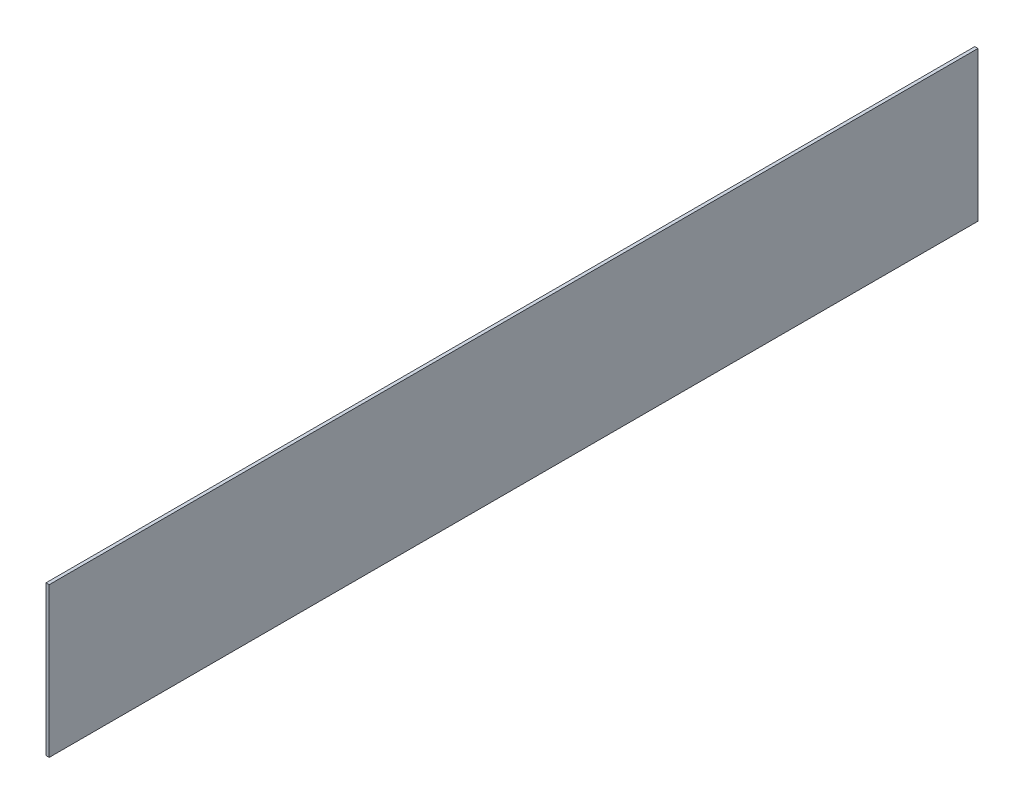
ISO-10303-21;
HEADER;
FILE_DESCRIPTION(('STEP AP214'),'2;1');
FILE_NAME('part.step','',(''),(''),'','','');
FILE_SCHEMA(('AUTOMOTIVE_DESIGN { 1 0 10303 214 1 1 1 1 }'));
ENDSEC;
DATA;
#1=APPLICATION_CONTEXT('core data for automotive mechanical design processes');
#2=APPLICATION_PROTOCOL_DEFINITION('international standard','automotive_design',2000,#1);
#3=PRODUCT_CONTEXT('',#1,'mechanical');
#4=PRODUCT('Part','Part','',(#3));
#5=PRODUCT_RELATED_PRODUCT_CATEGORY('part','',(#4));
#6=PRODUCT_DEFINITION_FORMATION('','',#4);
#7=PRODUCT_DEFINITION_CONTEXT('part definition',#1,'design');
#8=PRODUCT_DEFINITION('design','',#6,#7);
#9=PRODUCT_DEFINITION_SHAPE('','',#8);
#10=(LENGTH_UNIT() NAMED_UNIT(*) SI_UNIT(.MILLI.,.METRE.));
#11=(NAMED_UNIT(*) PLANE_ANGLE_UNIT() SI_UNIT($,.RADIAN.));
#12=(NAMED_UNIT(*) SI_UNIT($,.STERADIAN.) SOLID_ANGLE_UNIT());
#13=UNCERTAINTY_MEASURE_WITH_UNIT(LENGTH_MEASURE(1.E-05),#10,'distance_accuracy_value','');
#14=(GEOMETRIC_REPRESENTATION_CONTEXT(3) GLOBAL_UNCERTAINTY_ASSIGNED_CONTEXT((#13)) GLOBAL_UNIT_ASSIGNED_CONTEXT((#10,
#11,#12)) REPRESENTATION_CONTEXT('',''));
#15=CARTESIAN_POINT('',(0.,0.,0.));
#16=DIRECTION('',(0.,0.,1.));
#17=DIRECTION('',(1.,0.,0.));
#18=AXIS2_PLACEMENT_3D('',#15,#16,#17);
#19=CARTESIAN_POINT('',(-255.16572497106,1.31866739749864E-10,914.4));
#20=DIRECTION('',(-1.,0.,0.));
#21=DIRECTION('',(0.,0.,1.));
#22=AXIS2_PLACEMENT_3D('',#19,#20,#21);
#23=PLANE('',#22);
#24=DIRECTION('',(0.,0.,-1.));
#25=VECTOR('',#24,1.);
#26=CARTESIAN_POINT('',(-255.16572497106,-147.319999999975,1808.3229528099));
#27=LINE('',#26,#25);
#28=CARTESIAN_POINT('',(-255.16572497106,-147.319999999975,0.));
#29=VERTEX_POINT('',#28);
#30=CARTESIAN_POINT('',(-255.16572497106,-147.319999999976,1828.8));
#31=VERTEX_POINT('',#30);
#32=EDGE_CURVE('E55',#29,#31,#27,.F.);
#33=ORIENTED_EDGE('',*,*,#32,.F.);
#34=DIRECTION('',(0.,1.,0.));
#35=VECTOR('',#34,1.);
#36=CARTESIAN_POINT('',(-255.16572497106,-21.4565362286324,0.));
#37=LINE('',#36,#35);
#38=CARTESIAN_POINT('',(-255.16572497106,147.320000000051,0.));
#39=VERTEX_POINT('',#38);
#40=EDGE_CURVE('E19',#29,#39,#37,.T.);
#41=ORIENTED_EDGE('',*,*,#40,.T.);
#42=DIRECTION('',(0.,0.,-1.));
#43=VECTOR('',#42,1.);
#44=CARTESIAN_POINT('',(-255.16572497106,147.320000000025,1808.3229528099));
#45=LINE('',#44,#43);
#46=CARTESIAN_POINT('',(-255.16572497106,147.320000000041,1828.8));
#47=VERTEX_POINT('',#46);
#48=EDGE_CURVE('E78',#39,#47,#45,.F.);
#49=ORIENTED_EDGE('',*,*,#48,.T.);
#50=DIRECTION('',(0.,1.,0.));
#51=VECTOR('',#50,1.);
#52=CARTESIAN_POINT('',(-255.16572497106,500000.000000032,1828.8));
#53=LINE('',#52,#51);
#54=EDGE_CURVE('E67',#31,#47,#53,.T.);
#55=ORIENTED_EDGE('',*,*,#54,.F.);
#56=EDGE_LOOP('',(#33,#41,#49,#55));
#57=FACE_BOUND('',#56,.T.);
#58=ADVANCED_FACE('F16',(#57),#23,.F.);
#59=CARTESIAN_POINT('',(-261.51572497106,-21.4565362286324,0.));
#60=DIRECTION('',(0.,0.,1.));
#61=DIRECTION('',(1.,0.,0.));
#62=AXIS2_PLACEMENT_3D('',#59,#60,#61);
#63=PLANE('',#62);
#64=DIRECTION('',(0.,1.,0.));
#65=VECTOR('',#64,1.);
#66=CARTESIAN_POINT('',(-261.51572497106,1.31880617537653E-10,0.));
#67=LINE('',#66,#65);
#68=CARTESIAN_POINT('',(-261.51572497106,147.320000000064,0.));
#69=VERTEX_POINT('',#68);
#70=CARTESIAN_POINT('',(-261.51572497106,-147.319999999975,0.));
#71=VERTEX_POINT('',#70);
#72=EDGE_CURVE('E82',#69,#71,#67,.F.);
#73=ORIENTED_EDGE('',*,*,#72,.F.);
#74=DIRECTION('',(1.,0.,0.));
#75=VECTOR('',#74,1.);
#76=CARTESIAN_POINT('',(-261.51572497106,147.320000000025,0.));
#77=LINE('',#76,#75);
#78=EDGE_CURVE('E64',#69,#39,#77,.T.);
#79=ORIENTED_EDGE('',*,*,#78,.T.);
#80=ORIENTED_EDGE('',*,*,#40,.F.);
#81=DIRECTION('',(1.,0.,0.));
#82=VECTOR('',#81,1.);
#83=CARTESIAN_POINT('',(-261.51572497106,-147.319999999975,0.));
#84=LINE('',#83,#82);
#85=EDGE_CURVE('E61',#71,#29,#84,.T.);
#86=ORIENTED_EDGE('',*,*,#85,.F.);
#87=EDGE_LOOP('',(#73,#79,#80,#86));
#88=FACE_BOUND('',#87,.T.);
#89=ADVANCED_FACE('F60',(#88),#63,.F.);
#90=CARTESIAN_POINT('',(-261.51572497106,-147.319999999975,1808.3229528099));
#91=DIRECTION('',(0.,-1.,0.));
#92=DIRECTION('',(0.,0.,-1.));
#93=AXIS2_PLACEMENT_3D('',#90,#91,#92);
#94=PLANE('',#93);
#95=ORIENTED_EDGE('',*,*,#85,.T.);
#96=ORIENTED_EDGE('',*,*,#32,.T.);
#97=DIRECTION('',(1.,0.,0.));
#98=VECTOR('',#97,1.);
#99=CARTESIAN_POINT('',(-261.515724970806,-147.319999999979,1828.8));
#100=LINE('',#99,#98);
#101=CARTESIAN_POINT('',(-261.51572497106,-147.319999999976,1828.8));
#102=VERTEX_POINT('',#101);
#103=EDGE_CURVE('E69',#102,#31,#100,.T.);
#104=ORIENTED_EDGE('',*,*,#103,.F.);
#105=DIRECTION('',(0.,0.,1.));
#106=VECTOR('',#105,1.);
#107=CARTESIAN_POINT('',(-261.51572497106,-147.319999999975,914.4));
#108=LINE('',#107,#106);
#109=EDGE_CURVE('E73',#71,#102,#108,.T.);
#110=ORIENTED_EDGE('',*,*,#109,.F.);
#111=EDGE_LOOP('',(#95,#96,#104,#110));
#112=FACE_BOUND('',#111,.T.);
#113=ADVANCED_FACE('F71',(#112),#94,.T.);
#114=CARTESIAN_POINT('',(-261.515724970806,500000.000000032,1828.8));
#115=DIRECTION('',(0.,0.,1.));
#116=DIRECTION('',(1.,0.,0.));
#117=AXIS2_PLACEMENT_3D('',#114,#115,#116);
#118=PLANE('',#117);
#119=ORIENTED_EDGE('',*,*,#103,.T.);
#120=ORIENTED_EDGE('',*,*,#54,.T.);
#121=DIRECTION('',(1.,0.,0.));
#122=VECTOR('',#121,1.);
#123=CARTESIAN_POINT('',(-261.51572497106,147.320000000025,1828.8));
#124=LINE('',#123,#122);
#125=CARTESIAN_POINT('',(-261.51572497106,147.320000000043,1828.8));
#126=VERTEX_POINT('',#125);
#127=EDGE_CURVE('E34',#47,#126,#124,.F.);
#128=ORIENTED_EDGE('',*,*,#127,.T.);
#129=DIRECTION('',(0.,1.,0.));
#130=VECTOR('',#129,1.);
#131=CARTESIAN_POINT('',(-261.51572497106,1.31880617537653E-10,1828.8));
#132=LINE('',#131,#130);
#133=EDGE_CURVE('E25',#102,#126,#132,.T.);
#134=ORIENTED_EDGE('',*,*,#133,.F.);
#135=EDGE_LOOP('',(#119,#120,#128,#134));
#136=FACE_BOUND('',#135,.T.);
#137=ADVANCED_FACE('F88',(#136),#118,.T.);
#138=CARTESIAN_POINT('',(-261.51572497106,147.320000000025,1808.3229528099));
#139=DIRECTION('',(0.,-1.,0.));
#140=DIRECTION('',(0.,0.,-1.));
#141=AXIS2_PLACEMENT_3D('',#138,#139,#140);
#142=PLANE('',#141);
#143=DIRECTION('',(0.,0.,1.));
#144=VECTOR('',#143,1.);
#145=CARTESIAN_POINT('',(-261.51572497106,147.320000000076,914.4));
#146=LINE('',#145,#144);
#147=EDGE_CURVE('E11',#126,#69,#146,.F.);
#148=ORIENTED_EDGE('',*,*,#147,.F.);
#149=ORIENTED_EDGE('',*,*,#127,.F.);
#150=ORIENTED_EDGE('',*,*,#48,.F.);
#151=ORIENTED_EDGE('',*,*,#78,.F.);
#152=EDGE_LOOP('',(#148,#149,#150,#151));
#153=FACE_BOUND('',#152,.T.);
#154=ADVANCED_FACE('F90',(#153),#142,.F.);
#155=CARTESIAN_POINT('',(-261.51572497106,1.31880617537653E-10,914.4));
#156=DIRECTION('',(-1.,0.,0.));
#157=DIRECTION('',(0.,0.,1.));
#158=AXIS2_PLACEMENT_3D('',#155,#156,#157);
#159=PLANE('',#158);
#160=ORIENTED_EDGE('',*,*,#133,.T.);
#161=ORIENTED_EDGE('',*,*,#147,.T.);
#162=ORIENTED_EDGE('',*,*,#72,.T.);
#163=ORIENTED_EDGE('',*,*,#109,.T.);
#164=EDGE_LOOP('',(#160,#161,#162,#163));
#165=FACE_BOUND('',#164,.T.);
#166=ADVANCED_FACE('F87',(#165),#159,.T.);
#167=CLOSED_SHELL('',(#58,#89,#113,#137,#154,#166));
#168=MANIFOLD_SOLID_BREP('B1',#167);
#169=ADVANCED_BREP_SHAPE_REPRESENTATION('',(#18,#168),#14);
#170=SHAPE_DEFINITION_REPRESENTATION(#9,#169);
ENDSEC;
END-ISO-10303-21;
